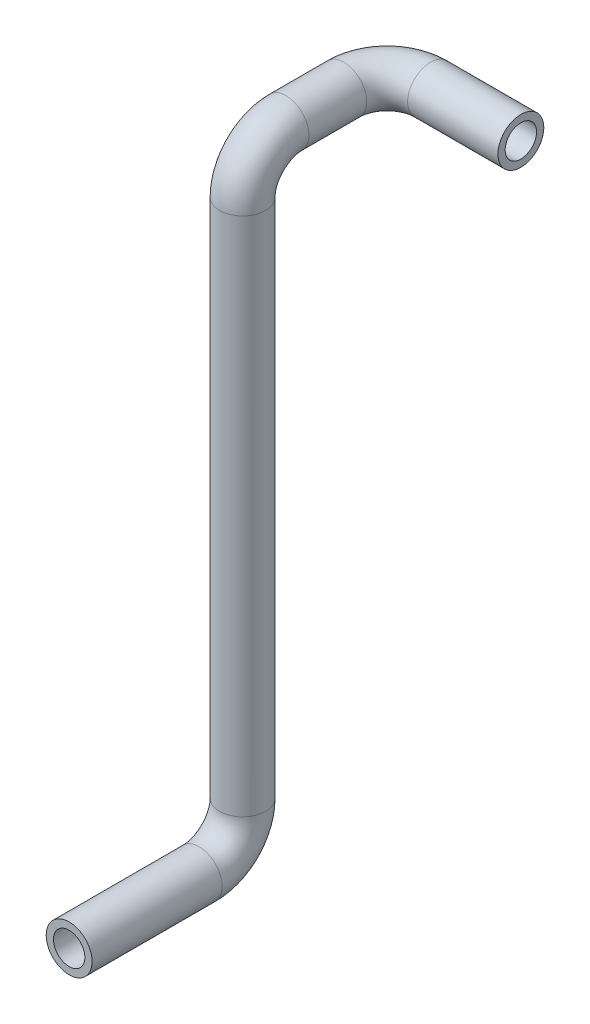
ISO-10303-21;
HEADER;
FILE_DESCRIPTION(('STEP AP214'),'2;1');
FILE_NAME('part.step','',(''),(''),'','','');
FILE_SCHEMA(('AUTOMOTIVE_DESIGN { 1 0 10303 214 1 1 1 1 }'));
ENDSEC;
DATA;
#1=APPLICATION_CONTEXT('core data for automotive mechanical design processes');
#2=APPLICATION_PROTOCOL_DEFINITION('international standard','automotive_design',2000,#1);
#3=PRODUCT_CONTEXT('',#1,'mechanical');
#4=PRODUCT('Part','Part','',(#3));
#5=PRODUCT_RELATED_PRODUCT_CATEGORY('part','',(#4));
#6=PRODUCT_DEFINITION_FORMATION('','',#4);
#7=PRODUCT_DEFINITION_CONTEXT('part definition',#1,'design');
#8=PRODUCT_DEFINITION('design','',#6,#7);
#9=PRODUCT_DEFINITION_SHAPE('','',#8);
#10=(LENGTH_UNIT() NAMED_UNIT(*) SI_UNIT(.MILLI.,.METRE.));
#11=(NAMED_UNIT(*) PLANE_ANGLE_UNIT() SI_UNIT($,.RADIAN.));
#12=(NAMED_UNIT(*) SI_UNIT($,.STERADIAN.) SOLID_ANGLE_UNIT());
#13=UNCERTAINTY_MEASURE_WITH_UNIT(LENGTH_MEASURE(1.E-05),#10,'distance_accuracy_value','');
#14=(GEOMETRIC_REPRESENTATION_CONTEXT(3) GLOBAL_UNCERTAINTY_ASSIGNED_CONTEXT((#13)) GLOBAL_UNIT_ASSIGNED_CONTEXT((#10,
#11,#12)) REPRESENTATION_CONTEXT('',''));
#15=CARTESIAN_POINT('',(0.,0.,0.));
#16=DIRECTION('',(0.,0.,1.));
#17=DIRECTION('',(1.,0.,0.));
#18=AXIS2_PLACEMENT_3D('',#15,#16,#17);
#19=CARTESIAN_POINT('',(-131.5,100.,50.));
#20=DIRECTION('',(1.,0.,0.));
#21=DIRECTION('',(0.,0.,-1.));
#22=AXIS2_PLACEMENT_3D('',#19,#20,#21);
#23=PLANE('',#22);
#24=CARTESIAN_POINT('',(-131.5,100.,50.));
#25=DIRECTION('',(1.,0.,0.));
#26=DIRECTION('',(0.,0.,-1.));
#27=AXIS2_PLACEMENT_3D('',#24,#25,#26);
#28=CIRCLE('',#27,2.17500000000001);
#29=CARTESIAN_POINT('',(-131.5,100.,47.825));
#30=VERTEX_POINT('',#29);
#31=EDGE_CURVE('E263',#30,#30,#28,.T.);
#32=ORIENTED_EDGE('',*,*,#31,.F.);
#33=EDGE_LOOP('',(#32));
#34=FACE_BOUND('',#33,.T.);
#35=CARTESIAN_POINT('',(-131.5,100.,50.));
#36=DIRECTION('',(1.,0.,0.));
#37=DIRECTION('',(0.,0.,-1.));
#38=AXIS2_PLACEMENT_3D('',#35,#36,#37);
#39=CIRCLE('',#38,3.17500000000001);
#40=CARTESIAN_POINT('',(-131.5,100.,46.825));
#41=VERTEX_POINT('',#40);
#42=EDGE_CURVE('E75',#41,#41,#39,.T.);
#43=ORIENTED_EDGE('',*,*,#42,.T.);
#44=EDGE_LOOP('',(#43));
#45=FACE_BOUND('',#44,.T.);
#46=ADVANCED_FACE('F52',(#34,#45),#23,.T.);
#47=CARTESIAN_POINT('',(-150.,16.,94.));
#48=DIRECTION('',(0.,0.,-1.));
#49=DIRECTION('',(-1.,0.,0.));
#50=AXIS2_PLACEMENT_3D('',#47,#48,#49);
#51=PLANE('',#50);
#52=CARTESIAN_POINT('',(-150.,16.,94.));
#53=DIRECTION('',(0.,0.,-1.));
#54=DIRECTION('',(-1.,0.,0.));
#55=AXIS2_PLACEMENT_3D('',#52,#53,#54);
#56=CIRCLE('',#55,2.17500000000001);
#57=CARTESIAN_POINT('',(-152.175,16.,94.));
#58=VERTEX_POINT('',#57);
#59=EDGE_CURVE('E73',#58,#58,#56,.T.);
#60=ORIENTED_EDGE('',*,*,#59,.T.);
#61=EDGE_LOOP('',(#60));
#62=FACE_BOUND('',#61,.T.);
#63=CARTESIAN_POINT('',(-150.,16.,94.));
#64=DIRECTION('',(0.,0.,-1.));
#65=DIRECTION('',(-1.,0.,0.));
#66=AXIS2_PLACEMENT_3D('',#63,#64,#65);
#67=CIRCLE('',#66,3.17500000000001);
#68=CARTESIAN_POINT('',(-153.175,16.,94.));
#69=VERTEX_POINT('',#68);
#70=EDGE_CURVE('E11',#69,#69,#67,.T.);
#71=ORIENTED_EDGE('',*,*,#70,.F.);
#72=EDGE_LOOP('',(#71));
#73=FACE_BOUND('',#72,.T.);
#74=ADVANCED_FACE('F149',(#62,#73),#51,.F.);
#75=CARTESIAN_POINT('',(-131.5,100.,50.));
#76=DIRECTION('',(-1.,0.,0.));
#77=DIRECTION('',(0.,0.,1.));
#78=AXIS2_PLACEMENT_3D('',#75,#76,#77);
#79=CYLINDRICAL_SURFACE('',#78,3.17500000000001);
#80=CARTESIAN_POINT('',(-144.,100.,50.));
#81=DIRECTION('',(-1.,0.,0.));
#82=DIRECTION('',(0.,0.,1.));
#83=AXIS2_PLACEMENT_3D('',#80,#81,#82);
#84=CIRCLE('',#83,3.17500000000001);
#85=CARTESIAN_POINT('',(-144.,100.,46.825));
#86=VERTEX_POINT('',#85);
#87=EDGE_CURVE('E74',#86,#86,#84,.F.);
#88=ORIENTED_EDGE('',*,*,#87,.T.);
#89=EDGE_LOOP('',(#88));
#90=FACE_BOUND('',#89,.T.);
#91=ORIENTED_EDGE('',*,*,#42,.F.);
#92=EDGE_LOOP('',(#91));
#93=FACE_BOUND('',#92,.T.);
#94=ADVANCED_FACE('F155',(#90,#93),#79,.T.);
#95=CARTESIAN_POINT('',(-144.,100.,56.));
#96=DIRECTION('',(0.,1.,0.));
#97=DIRECTION('',(0.,0.,1.));
#98=AXIS2_PLACEMENT_3D('',#95,#96,#97);
#99=TOROIDAL_SURFACE('',#98,5.99999999999998,3.17500000000001);
#100=CARTESIAN_POINT('',(-150.,100.,55.9999999999998));
#101=DIRECTION('',(0.,0.,-1.));
#102=DIRECTION('',(-1.,0.,0.));
#103=AXIS2_PLACEMENT_3D('',#100,#101,#102);
#104=CIRCLE('',#103,3.17500000000001);
#105=CARTESIAN_POINT('',(-153.175,100.,55.9999999999996));
#106=VERTEX_POINT('',#105);
#107=EDGE_CURVE('E78',#106,#106,#104,.T.);
#108=CARTESIAN_POINT('',(-144.,100.,56.));
#109=DIRECTION('',(0.,1.,0.));
#110=DIRECTION('',(0.,0.,1.));
#111=AXIS2_PLACEMENT_3D('',#108,#109,#110);
#112=CIRCLE('',#111,9.175);
#113=EDGE_CURVE('',#86,#106,#112,.T.);
#114=ORIENTED_EDGE('',*,*,#87,.F.);
#115=ORIENTED_EDGE('',*,*,#107,.T.);
#116=ORIENTED_EDGE('',*,*,#113,.T.);
#117=ORIENTED_EDGE('',*,*,#113,.F.);
#118=EDGE_LOOP('',(#114,#116,#115,#117));
#119=FACE_BOUND('',#118,.T.);
#120=ADVANCED_FACE('F158',(#119),#99,.T.);
#121=CARTESIAN_POINT('',(-150.,100.,56.));
#122=DIRECTION('',(0.,0.,1.));
#123=DIRECTION('',(1.,0.,0.));
#124=AXIS2_PLACEMENT_3D('',#121,#122,#123);
#125=CYLINDRICAL_SURFACE('',#124,3.17500000000001);
#126=CARTESIAN_POINT('',(-150.,100.,64.));
#127=DIRECTION('',(0.,0.,1.));
#128=DIRECTION('',(1.,0.,0.));
#129=AXIS2_PLACEMENT_3D('',#126,#127,#128);
#130=CIRCLE('',#129,3.17500000000001);
#131=CARTESIAN_POINT('',(-150.,103.175,64.));
#132=VERTEX_POINT('',#131);
#133=EDGE_CURVE('E91',#132,#132,#130,.F.);
#134=ORIENTED_EDGE('',*,*,#133,.T.);
#135=EDGE_LOOP('',(#134));
#136=FACE_BOUND('',#135,.T.);
#137=ORIENTED_EDGE('',*,*,#107,.F.);
#138=EDGE_LOOP('',(#137));
#139=FACE_BOUND('',#138,.T.);
#140=ADVANCED_FACE('F109',(#136,#139),#125,.T.);
#141=CARTESIAN_POINT('',(-150.,94.,64.));
#142=DIRECTION('',(1.,0.,0.));
#143=DIRECTION('',(0.,0.,-1.));
#144=AXIS2_PLACEMENT_3D('',#141,#142,#143);
#145=TOROIDAL_SURFACE('',#144,6.00000000000023,3.17500000000001);
#146=CARTESIAN_POINT('',(-150.,94.,70.0000000000002));
#147=DIRECTION('',(0.,1.,0.));
#148=DIRECTION('',(0.,0.,1.));
#149=AXIS2_PLACEMENT_3D('',#146,#147,#148);
#150=CIRCLE('',#149,3.17500000000001);
#151=CARTESIAN_POINT('',(-150.,94.,73.1750000000002));
#152=VERTEX_POINT('',#151);
#153=EDGE_CURVE('E68',#152,#152,#150,.T.);
#154=CARTESIAN_POINT('',(-150.,94.,64.));
#155=DIRECTION('',(1.,0.,0.));
#156=DIRECTION('',(0.,0.,-1.));
#157=AXIS2_PLACEMENT_3D('',#154,#155,#156);
#158=CIRCLE('',#157,9.17500000000024);
#159=EDGE_CURVE('',#132,#152,#158,.T.);
#160=ORIENTED_EDGE('',*,*,#133,.F.);
#161=ORIENTED_EDGE('',*,*,#153,.T.);
#162=ORIENTED_EDGE('',*,*,#159,.T.);
#163=ORIENTED_EDGE('',*,*,#159,.F.);
#164=EDGE_LOOP('',(#160,#162,#161,#163));
#165=FACE_BOUND('',#164,.T.);
#166=ADVANCED_FACE('F98',(#165),#145,.T.);
#167=CARTESIAN_POINT('',(-150.,94.,70.));
#168=DIRECTION('',(0.,-1.,0.));
#169=DIRECTION('',(0.,0.,-1.));
#170=AXIS2_PLACEMENT_3D('',#167,#168,#169);
#171=CYLINDRICAL_SURFACE('',#170,3.17500000000001);
#172=CARTESIAN_POINT('',(-150.,22.,70.));
#173=DIRECTION('',(0.,-1.,0.));
#174=DIRECTION('',(0.,0.,-1.));
#175=AXIS2_PLACEMENT_3D('',#172,#173,#174);
#176=CIRCLE('',#175,3.17500000000001);
#177=CARTESIAN_POINT('',(-150.,22.,66.825));
#178=VERTEX_POINT('',#177);
#179=EDGE_CURVE('E63',#178,#178,#176,.F.);
#180=ORIENTED_EDGE('',*,*,#179,.T.);
#181=EDGE_LOOP('',(#180));
#182=FACE_BOUND('',#181,.T.);
#183=ORIENTED_EDGE('',*,*,#153,.F.);
#184=EDGE_LOOP('',(#183));
#185=FACE_BOUND('',#184,.T.);
#186=ADVANCED_FACE('F101',(#182,#185),#171,.T.);
#187=CARTESIAN_POINT('',(-150.,22.,76.));
#188=DIRECTION('',(-1.,0.,0.));
#189=DIRECTION('',(0.,0.,1.));
#190=AXIS2_PLACEMENT_3D('',#187,#188,#189);
#191=TOROIDAL_SURFACE('',#190,6.00000000000001,3.17500000000001);
#192=CARTESIAN_POINT('',(-150.,16.,76.));
#193=DIRECTION('',(0.,0.,-1.));
#194=DIRECTION('',(0.,1.,0.));
#195=AXIS2_PLACEMENT_3D('',#192,#193,#194);
#196=CIRCLE('',#195,3.17500000000001);
#197=CARTESIAN_POINT('',(-150.,12.825,75.9999999999999));
#198=VERTEX_POINT('',#197);
#199=EDGE_CURVE('E58',#198,#198,#196,.T.);
#200=CARTESIAN_POINT('',(-150.,22.,76.));
#201=DIRECTION('',(-1.,0.,0.));
#202=DIRECTION('',(0.,0.,1.));
#203=AXIS2_PLACEMENT_3D('',#200,#201,#202);
#204=CIRCLE('',#203,9.17500000000002);
#205=EDGE_CURVE('',#178,#198,#204,.T.);
#206=ORIENTED_EDGE('',*,*,#179,.F.);
#207=ORIENTED_EDGE('',*,*,#199,.T.);
#208=ORIENTED_EDGE('',*,*,#205,.T.);
#209=ORIENTED_EDGE('',*,*,#205,.F.);
#210=EDGE_LOOP('',(#206,#208,#207,#209));
#211=FACE_BOUND('',#210,.T.);
#212=ADVANCED_FACE('F103',(#211),#191,.T.);
#213=CARTESIAN_POINT('',(-150.,16.,76.));
#214=DIRECTION('',(0.,0.,1.));
#215=DIRECTION('',(1.,0.,0.));
#216=AXIS2_PLACEMENT_3D('',#213,#214,#215);
#217=CYLINDRICAL_SURFACE('',#216,3.17500000000001);
#218=ORIENTED_EDGE('',*,*,#70,.T.);
#219=EDGE_LOOP('',(#218));
#220=FACE_BOUND('',#219,.T.);
#221=ORIENTED_EDGE('',*,*,#199,.F.);
#222=EDGE_LOOP('',(#221));
#223=FACE_BOUND('',#222,.T.);
#224=ADVANCED_FACE('F54',(#220,#223),#217,.T.);
#225=CARTESIAN_POINT('',(-131.5,100.,50.));
#226=DIRECTION('',(-1.,0.,0.));
#227=DIRECTION('',(0.,0.,1.));
#228=AXIS2_PLACEMENT_3D('',#225,#226,#227);
#229=CYLINDRICAL_SURFACE('',#228,2.17500000000001);
#230=CARTESIAN_POINT('',(-144.,100.,50.));
#231=DIRECTION('',(1.,0.,0.));
#232=DIRECTION('',(0.,0.,-1.));
#233=AXIS2_PLACEMENT_3D('',#230,#231,#232);
#234=CIRCLE('',#233,2.17500000000001);
#235=CARTESIAN_POINT('',(-144.,100.,47.825));
#236=VERTEX_POINT('',#235);
#237=EDGE_CURVE('E262',#236,#236,#234,.T.);
#238=ORIENTED_EDGE('',*,*,#237,.F.);
#239=EDGE_LOOP('',(#238));
#240=FACE_BOUND('',#239,.T.);
#241=ORIENTED_EDGE('',*,*,#31,.T.);
#242=EDGE_LOOP('',(#241));
#243=FACE_BOUND('',#242,.T.);
#244=ADVANCED_FACE('F114',(#240,#243),#229,.F.);
#245=CARTESIAN_POINT('',(-144.,100.,56.));
#246=DIRECTION('',(0.,1.,0.));
#247=DIRECTION('',(0.,0.,1.));
#248=AXIS2_PLACEMENT_3D('',#245,#246,#247);
#249=TOROIDAL_SURFACE('',#248,5.99999999999998,2.17500000000001);
#250=CARTESIAN_POINT('',(-150.,100.,55.9999999999998));
#251=DIRECTION('',(0.,0.,-1.));
#252=DIRECTION('',(-1.,0.,0.));
#253=AXIS2_PLACEMENT_3D('',#250,#251,#252);
#254=CIRCLE('',#253,2.17500000000001);
#255=CARTESIAN_POINT('',(-152.175,100.,55.9999999999998));
#256=VERTEX_POINT('',#255);
#257=EDGE_CURVE('E270',#256,#256,#254,.T.);
#258=CARTESIAN_POINT('',(-144.,100.,56.));
#259=DIRECTION('',(0.,1.,0.));
#260=DIRECTION('',(0.,0.,1.));
#261=AXIS2_PLACEMENT_3D('',#258,#259,#260);
#262=CIRCLE('',#261,8.175);
#263=EDGE_CURVE('',#236,#256,#262,.T.);
#264=ORIENTED_EDGE('',*,*,#237,.T.);
#265=ORIENTED_EDGE('',*,*,#257,.F.);
#266=ORIENTED_EDGE('',*,*,#263,.T.);
#267=ORIENTED_EDGE('',*,*,#263,.F.);
#268=EDGE_LOOP('',(#264,#266,#265,#267));
#269=FACE_BOUND('',#268,.T.);
#270=ADVANCED_FACE('F116',(#269),#249,.F.);
#271=CARTESIAN_POINT('',(-150.,100.,56.));
#272=DIRECTION('',(0.,0.,1.));
#273=DIRECTION('',(1.,0.,0.));
#274=AXIS2_PLACEMENT_3D('',#271,#272,#273);
#275=CYLINDRICAL_SURFACE('',#274,2.17500000000001);
#276=CARTESIAN_POINT('',(-150.,100.,64.));
#277=DIRECTION('',(0.,0.,-1.));
#278=DIRECTION('',(-1.,0.,0.));
#279=AXIS2_PLACEMENT_3D('',#276,#277,#278);
#280=CIRCLE('',#279,2.17500000000001);
#281=CARTESIAN_POINT('',(-150.,102.175,64.));
#282=VERTEX_POINT('',#281);
#283=EDGE_CURVE('E275',#282,#282,#280,.T.);
#284=ORIENTED_EDGE('',*,*,#283,.F.);
#285=EDGE_LOOP('',(#284));
#286=FACE_BOUND('',#285,.T.);
#287=ORIENTED_EDGE('',*,*,#257,.T.);
#288=EDGE_LOOP('',(#287));
#289=FACE_BOUND('',#288,.T.);
#290=ADVANCED_FACE('F123',(#286,#289),#275,.F.);
#291=CARTESIAN_POINT('',(-150.,94.,64.));
#292=DIRECTION('',(1.,0.,0.));
#293=DIRECTION('',(0.,0.,-1.));
#294=AXIS2_PLACEMENT_3D('',#291,#292,#293);
#295=TOROIDAL_SURFACE('',#294,6.00000000000023,2.17500000000001);
#296=CARTESIAN_POINT('',(-150.,94.,70.));
#297=DIRECTION('',(0.,1.,0.));
#298=DIRECTION('',(-1.,0.,0.));
#299=AXIS2_PLACEMENT_3D('',#296,#297,#298);
#300=CIRCLE('',#299,2.17500000000001);
#301=CARTESIAN_POINT('',(-150.,94.,72.1750000000002));
#302=VERTEX_POINT('',#301);
#303=EDGE_CURVE('E274',#302,#302,#300,.T.);
#304=CARTESIAN_POINT('',(-150.,94.,64.));
#305=DIRECTION('',(1.,0.,0.));
#306=DIRECTION('',(0.,0.,-1.));
#307=AXIS2_PLACEMENT_3D('',#304,#305,#306);
#308=CIRCLE('',#307,8.17500000000024);
#309=EDGE_CURVE('',#282,#302,#308,.T.);
#310=ORIENTED_EDGE('',*,*,#283,.T.);
#311=ORIENTED_EDGE('',*,*,#303,.F.);
#312=ORIENTED_EDGE('',*,*,#309,.T.);
#313=ORIENTED_EDGE('',*,*,#309,.F.);
#314=EDGE_LOOP('',(#310,#312,#311,#313));
#315=FACE_BOUND('',#314,.T.);
#316=ADVANCED_FACE('F131',(#315),#295,.F.);
#317=CARTESIAN_POINT('',(-150.,94.,70.));
#318=DIRECTION('',(0.,-1.,0.));
#319=DIRECTION('',(0.,0.,-1.));
#320=AXIS2_PLACEMENT_3D('',#317,#318,#319);
#321=CYLINDRICAL_SURFACE('',#320,2.17500000000001);
#322=CARTESIAN_POINT('',(-150.,22.,70.));
#323=DIRECTION('',(0.,1.,0.));
#324=DIRECTION('',(-1.,0.,0.));
#325=AXIS2_PLACEMENT_3D('',#322,#323,#324);
#326=CIRCLE('',#325,2.17500000000001);
#327=CARTESIAN_POINT('',(-150.,22.,67.825));
#328=VERTEX_POINT('',#327);
#329=EDGE_CURVE('E87',#328,#328,#326,.T.);
#330=ORIENTED_EDGE('',*,*,#329,.F.);
#331=EDGE_LOOP('',(#330));
#332=FACE_BOUND('',#331,.T.);
#333=ORIENTED_EDGE('',*,*,#303,.T.);
#334=EDGE_LOOP('',(#333));
#335=FACE_BOUND('',#334,.T.);
#336=ADVANCED_FACE('F136',(#332,#335),#321,.F.);
#337=CARTESIAN_POINT('',(-150.,22.,76.));
#338=DIRECTION('',(-1.,0.,0.));
#339=DIRECTION('',(0.,0.,1.));
#340=AXIS2_PLACEMENT_3D('',#337,#338,#339);
#341=TOROIDAL_SURFACE('',#340,6.00000000000001,2.17500000000001);
#342=CARTESIAN_POINT('',(-150.,16.0000000000002,76.));
#343=DIRECTION('',(0.,0.,-1.));
#344=DIRECTION('',(-1.,0.,0.));
#345=AXIS2_PLACEMENT_3D('',#342,#343,#344);
#346=CIRCLE('',#345,2.17500000000001);
#347=CARTESIAN_POINT('',(-150.,13.825,75.9999999999999));
#348=VERTEX_POINT('',#347);
#349=EDGE_CURVE('E85',#348,#348,#346,.T.);
#350=CARTESIAN_POINT('',(-150.,22.,76.));
#351=DIRECTION('',(-1.,0.,0.));
#352=DIRECTION('',(0.,0.,1.));
#353=AXIS2_PLACEMENT_3D('',#350,#351,#352);
#354=CIRCLE('',#353,8.17500000000001);
#355=EDGE_CURVE('',#328,#348,#354,.T.);
#356=ORIENTED_EDGE('',*,*,#329,.T.);
#357=ORIENTED_EDGE('',*,*,#349,.F.);
#358=ORIENTED_EDGE('',*,*,#355,.T.);
#359=ORIENTED_EDGE('',*,*,#355,.F.);
#360=EDGE_LOOP('',(#356,#358,#357,#359));
#361=FACE_BOUND('',#360,.T.);
#362=ADVANCED_FACE('F139',(#361),#341,.F.);
#363=CARTESIAN_POINT('',(-150.,16.,76.));
#364=DIRECTION('',(0.,0.,1.));
#365=DIRECTION('',(1.,0.,0.));
#366=AXIS2_PLACEMENT_3D('',#363,#364,#365);
#367=CYLINDRICAL_SURFACE('',#366,2.17500000000001);
#368=ORIENTED_EDGE('',*,*,#59,.F.);
#369=EDGE_LOOP('',(#368));
#370=FACE_BOUND('',#369,.T.);
#371=ORIENTED_EDGE('',*,*,#349,.T.);
#372=EDGE_LOOP('',(#371));
#373=FACE_BOUND('',#372,.T.);
#374=ADVANCED_FACE('F145',(#370,#373),#367,.F.);
#375=CLOSED_SHELL('',(#46,#74,#94,#120,#140,#166,#186,#212,#224,#244,#270,#290,#316,#336,#362,#374));
#376=MANIFOLD_SOLID_BREP('B2',#375);
#377=ADVANCED_BREP_SHAPE_REPRESENTATION('',(#18,#376),#14);
#378=SHAPE_DEFINITION_REPRESENTATION(#9,#377);
ENDSEC;
END-ISO-10303-21;
